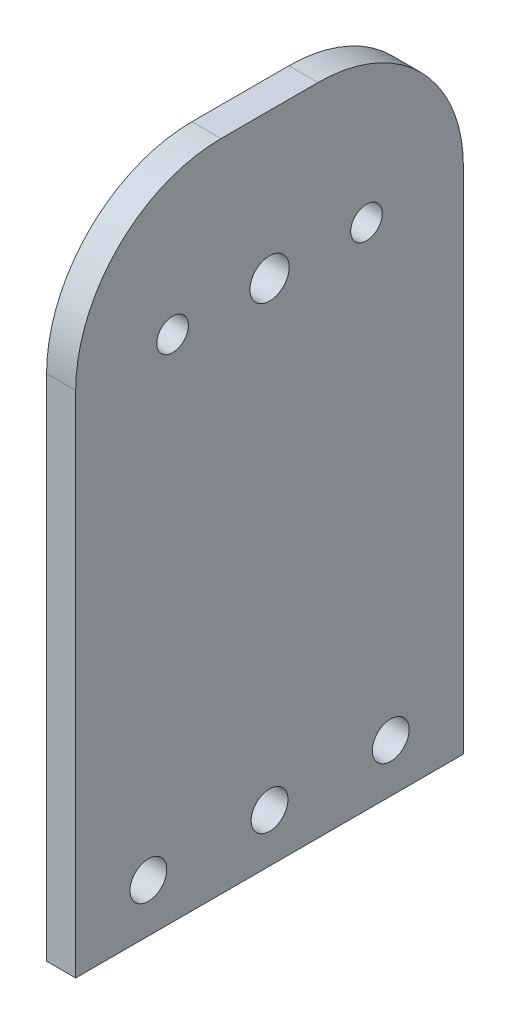
ISO-10303-21;
HEADER;
FILE_DESCRIPTION(('STEP AP214'),'2;1');
FILE_NAME('part.step','',(''),(''),'','','');
FILE_SCHEMA(('AUTOMOTIVE_DESIGN { 1 0 10303 214 1 1 1 1 }'));
ENDSEC;
DATA;
#1=APPLICATION_CONTEXT('core data for automotive mechanical design processes');
#2=APPLICATION_PROTOCOL_DEFINITION('international standard','automotive_design',2000,#1);
#3=PRODUCT_CONTEXT('',#1,'mechanical');
#4=PRODUCT('Part','Part','',(#3));
#5=PRODUCT_RELATED_PRODUCT_CATEGORY('part','',(#4));
#6=PRODUCT_DEFINITION_FORMATION('','',#4);
#7=PRODUCT_DEFINITION_CONTEXT('part definition',#1,'design');
#8=PRODUCT_DEFINITION('design','',#6,#7);
#9=PRODUCT_DEFINITION_SHAPE('','',#8);
#10=(LENGTH_UNIT() NAMED_UNIT(*) SI_UNIT(.MILLI.,.METRE.));
#11=(NAMED_UNIT(*) PLANE_ANGLE_UNIT() SI_UNIT($,.RADIAN.));
#12=(NAMED_UNIT(*) SI_UNIT($,.STERADIAN.) SOLID_ANGLE_UNIT());
#13=UNCERTAINTY_MEASURE_WITH_UNIT(LENGTH_MEASURE(1.E-05),#10,'distance_accuracy_value','');
#14=(GEOMETRIC_REPRESENTATION_CONTEXT(3) GLOBAL_UNCERTAINTY_ASSIGNED_CONTEXT((#13)) GLOBAL_UNIT_ASSIGNED_CONTEXT((#10,
#11,#12)) REPRESENTATION_CONTEXT('',''));
#15=CARTESIAN_POINT('',(0.,0.,0.));
#16=DIRECTION('',(0.,0.,1.));
#17=DIRECTION('',(1.,0.,0.));
#18=AXIS2_PLACEMENT_3D('',#15,#16,#17);
#19=CARTESIAN_POINT('',(3.,52.5,-15.));
#20=DIRECTION('',(-1.,0.,0.));
#21=DIRECTION('',(0.,0.,1.));
#22=AXIS2_PLACEMENT_3D('',#19,#20,#21);
#23=CYLINDRICAL_SURFACE('',#22,15.);
#24=CARTESIAN_POINT('',(0.,52.5,-15.));
#25=DIRECTION('',(1.,0.,0.));
#26=DIRECTION('',(0.,0.,-1.));
#27=AXIS2_PLACEMENT_3D('',#24,#25,#26);
#28=CIRCLE('',#27,15.);
#29=CARTESIAN_POINT('',(0.,52.5,0.));
#30=VERTEX_POINT('',#29);
#31=CARTESIAN_POINT('',(0.,67.5,-15.));
#32=VERTEX_POINT('',#31);
#33=EDGE_CURVE('E129',#30,#32,#28,.F.);
#34=ORIENTED_EDGE('',*,*,#33,.F.);
#35=DIRECTION('',(-1.,0.,0.));
#36=VECTOR('',#35,1.);
#37=CARTESIAN_POINT('',(3.,52.5,0.));
#38=LINE('',#37,#36);
#39=CARTESIAN_POINT('',(3.,52.5,0.));
#40=VERTEX_POINT('',#39);
#41=EDGE_CURVE('E11',#40,#30,#38,.T.);
#42=ORIENTED_EDGE('',*,*,#41,.F.);
#43=CARTESIAN_POINT('',(3.,52.5,-15.));
#44=DIRECTION('',(1.,0.,0.));
#45=DIRECTION('',(0.,0.,-1.));
#46=AXIS2_PLACEMENT_3D('',#43,#44,#45);
#47=CIRCLE('',#46,15.);
#48=CARTESIAN_POINT('',(3.,67.5,-15.));
#49=VERTEX_POINT('',#48);
#50=EDGE_CURVE('E149',#40,#49,#47,.F.);
#51=ORIENTED_EDGE('',*,*,#50,.T.);
#52=DIRECTION('',(-1.,0.,0.));
#53=VECTOR('',#52,1.);
#54=CARTESIAN_POINT('',(3.,67.5,-15.));
#55=LINE('',#54,#53);
#56=EDGE_CURVE('E59',#49,#32,#55,.T.);
#57=ORIENTED_EDGE('',*,*,#56,.T.);
#58=EDGE_LOOP('',(#34,#42,#51,#57));
#59=FACE_BOUND('',#58,.T.);
#60=ADVANCED_FACE('F41',(#59),#23,.T.);
#61=CARTESIAN_POINT('',(3.,0.,0.));
#62=DIRECTION('',(0.,0.,1.));
#63=DIRECTION('',(1.,0.,0.));
#64=AXIS2_PLACEMENT_3D('',#61,#62,#63);
#65=PLANE('',#64);
#66=DIRECTION('',(0.,1.,0.));
#67=VECTOR('',#66,1.);
#68=CARTESIAN_POINT('',(0.,0.,0.));
#69=LINE('',#68,#67);
#70=CARTESIAN_POINT('',(0.,0.,0.));
#71=VERTEX_POINT('',#70);
#72=EDGE_CURVE('E132',#71,#30,#69,.T.);
#73=ORIENTED_EDGE('',*,*,#72,.F.);
#74=DIRECTION('',(-1.,0.,0.));
#75=VECTOR('',#74,1.);
#76=CARTESIAN_POINT('',(3.,0.,0.));
#77=LINE('',#76,#75);
#78=CARTESIAN_POINT('',(3.,0.,0.));
#79=VERTEX_POINT('',#78);
#80=EDGE_CURVE('E51',#79,#71,#77,.T.);
#81=ORIENTED_EDGE('',*,*,#80,.F.);
#82=DIRECTION('',(0.,1.,0.));
#83=VECTOR('',#82,1.);
#84=CARTESIAN_POINT('',(3.,0.,0.));
#85=LINE('',#84,#83);
#86=EDGE_CURVE('E166',#79,#40,#85,.T.);
#87=ORIENTED_EDGE('',*,*,#86,.T.);
#88=ORIENTED_EDGE('',*,*,#41,.T.);
#89=EDGE_LOOP('',(#73,#81,#87,#88));
#90=FACE_BOUND('',#89,.T.);
#91=ADVANCED_FACE('F165',(#90),#65,.T.);
#92=CARTESIAN_POINT('',(3.,0.,0.));
#93=DIRECTION('',(0.,1.,0.));
#94=DIRECTION('',(0.,0.,1.));
#95=AXIS2_PLACEMENT_3D('',#92,#93,#94);
#96=PLANE('',#95);
#97=DIRECTION('',(0.,0.,-1.));
#98=VECTOR('',#97,1.);
#99=CARTESIAN_POINT('',(0.,0.,0.));
#100=LINE('',#99,#98);
#101=CARTESIAN_POINT('',(0.,0.,-40.));
#102=VERTEX_POINT('',#101);
#103=EDGE_CURVE('E137',#71,#102,#100,.T.);
#104=ORIENTED_EDGE('',*,*,#103,.T.);
#105=DIRECTION('',(-1.,0.,0.));
#106=VECTOR('',#105,1.);
#107=CARTESIAN_POINT('',(3.,0.,-40.));
#108=LINE('',#107,#106);
#109=CARTESIAN_POINT('',(3.,0.,-40.));
#110=VERTEX_POINT('',#109);
#111=EDGE_CURVE('E119',#110,#102,#108,.T.);
#112=ORIENTED_EDGE('',*,*,#111,.F.);
#113=DIRECTION('',(0.,0.,-1.));
#114=VECTOR('',#113,1.);
#115=CARTESIAN_POINT('',(3.,0.,0.));
#116=LINE('',#115,#114);
#117=EDGE_CURVE('E105',#79,#110,#116,.T.);
#118=ORIENTED_EDGE('',*,*,#117,.F.);
#119=ORIENTED_EDGE('',*,*,#80,.T.);
#120=EDGE_LOOP('',(#104,#112,#118,#119));
#121=FACE_BOUND('',#120,.T.);
#122=ADVANCED_FACE('F159',(#121),#96,.F.);
#123=CARTESIAN_POINT('',(3.,0.,-40.));
#124=DIRECTION('',(0.,0.,1.));
#125=DIRECTION('',(1.,0.,0.));
#126=AXIS2_PLACEMENT_3D('',#123,#124,#125);
#127=PLANE('',#126);
#128=DIRECTION('',(0.,1.,0.));
#129=VECTOR('',#128,1.);
#130=CARTESIAN_POINT('',(0.,0.,-40.));
#131=LINE('',#130,#129);
#132=CARTESIAN_POINT('',(0.,52.5,-40.));
#133=VERTEX_POINT('',#132);
#134=EDGE_CURVE('E115',#102,#133,#131,.T.);
#135=ORIENTED_EDGE('',*,*,#134,.T.);
#136=DIRECTION('',(-1.,0.,0.));
#137=VECTOR('',#136,1.);
#138=CARTESIAN_POINT('',(3.,52.5,-40.));
#139=LINE('',#138,#137);
#140=CARTESIAN_POINT('',(3.,52.5,-40.));
#141=VERTEX_POINT('',#140);
#142=EDGE_CURVE('E112',#141,#133,#139,.T.);
#143=ORIENTED_EDGE('',*,*,#142,.F.);
#144=DIRECTION('',(0.,1.,0.));
#145=VECTOR('',#144,1.);
#146=CARTESIAN_POINT('',(3.,0.,-40.));
#147=LINE('',#146,#145);
#148=EDGE_CURVE('E97',#110,#141,#147,.T.);
#149=ORIENTED_EDGE('',*,*,#148,.F.);
#150=ORIENTED_EDGE('',*,*,#111,.T.);
#151=EDGE_LOOP('',(#135,#143,#149,#150));
#152=FACE_BOUND('',#151,.T.);
#153=ADVANCED_FACE('F113',(#152),#127,.F.);
#154=CARTESIAN_POINT('',(3.,52.5,-25.));
#155=DIRECTION('',(-1.,0.,0.));
#156=DIRECTION('',(0.,0.,1.));
#157=AXIS2_PLACEMENT_3D('',#154,#155,#156);
#158=CYLINDRICAL_SURFACE('',#157,15.);
#159=CARTESIAN_POINT('',(0.,52.5,-25.));
#160=DIRECTION('',(1.,0.,0.));
#161=DIRECTION('',(0.,0.,-1.));
#162=AXIS2_PLACEMENT_3D('',#159,#160,#161);
#163=CIRCLE('',#162,15.);
#164=CARTESIAN_POINT('',(0.,67.5,-25.));
#165=VERTEX_POINT('',#164);
#166=EDGE_CURVE('E142',#165,#133,#163,.F.);
#167=ORIENTED_EDGE('',*,*,#166,.F.);
#168=DIRECTION('',(-1.,0.,0.));
#169=VECTOR('',#168,1.);
#170=CARTESIAN_POINT('',(3.,67.5,-25.));
#171=LINE('',#170,#169);
#172=CARTESIAN_POINT('',(3.,67.5,-25.));
#173=VERTEX_POINT('',#172);
#174=EDGE_CURVE('E78',#173,#165,#171,.T.);
#175=ORIENTED_EDGE('',*,*,#174,.F.);
#176=CARTESIAN_POINT('',(3.,52.5,-25.));
#177=DIRECTION('',(1.,0.,0.));
#178=DIRECTION('',(0.,0.,-1.));
#179=AXIS2_PLACEMENT_3D('',#176,#177,#178);
#180=CIRCLE('',#179,15.);
#181=EDGE_CURVE('E102',#173,#141,#180,.F.);
#182=ORIENTED_EDGE('',*,*,#181,.T.);
#183=ORIENTED_EDGE('',*,*,#142,.T.);
#184=EDGE_LOOP('',(#167,#175,#182,#183));
#185=FACE_BOUND('',#184,.T.);
#186=ADVANCED_FACE('F121',(#185),#158,.T.);
#187=CARTESIAN_POINT('',(3.,67.5,0.));
#188=DIRECTION('',(0.,1.,0.));
#189=DIRECTION('',(0.,0.,1.));
#190=AXIS2_PLACEMENT_3D('',#187,#188,#189);
#191=PLANE('',#190);
#192=DIRECTION('',(0.,0.,-1.));
#193=VECTOR('',#192,1.);
#194=CARTESIAN_POINT('',(0.,67.5,0.));
#195=LINE('',#194,#193);
#196=EDGE_CURVE('E145',#32,#165,#195,.T.);
#197=ORIENTED_EDGE('',*,*,#196,.F.);
#198=ORIENTED_EDGE('',*,*,#56,.F.);
#199=DIRECTION('',(0.,0.,-1.));
#200=VECTOR('',#199,1.);
#201=CARTESIAN_POINT('',(3.,67.5,0.));
#202=LINE('',#201,#200);
#203=EDGE_CURVE('E123',#49,#173,#202,.T.);
#204=ORIENTED_EDGE('',*,*,#203,.T.);
#205=ORIENTED_EDGE('',*,*,#174,.T.);
#206=EDGE_LOOP('',(#197,#198,#204,#205));
#207=FACE_BOUND('',#206,.T.);
#208=ADVANCED_FACE('F167',(#207),#191,.T.);
#209=CARTESIAN_POINT('',(3.,0.,0.));
#210=DIRECTION('',(1.,0.,0.));
#211=DIRECTION('',(0.,0.,-1.));
#212=AXIS2_PLACEMENT_3D('',#209,#210,#211);
#213=PLANE('',#212);
#214=CARTESIAN_POINT('',(3.,52.5,-10.));
#215=DIRECTION('',(1.,0.,0.));
#216=DIRECTION('',(0.,0.,-1.));
#217=AXIS2_PLACEMENT_3D('',#214,#215,#216);
#218=CIRCLE('',#217,1.63194999999999);
#219=CARTESIAN_POINT('',(3.,52.5,-11.63195));
#220=VERTEX_POINT('',#219);
#221=EDGE_CURVE('E284',#220,#220,#218,.T.);
#222=ORIENTED_EDGE('',*,*,#221,.F.);
#223=EDGE_LOOP('',(#222));
#224=FACE_BOUND('',#223,.T.);
#225=CARTESIAN_POINT('',(3.,52.5,-30.));
#226=DIRECTION('',(1.,0.,0.));
#227=DIRECTION('',(0.,0.,-1.));
#228=AXIS2_PLACEMENT_3D('',#225,#226,#227);
#229=CIRCLE('',#228,1.63194999999999);
#230=CARTESIAN_POINT('',(3.,52.5,-31.63195));
#231=VERTEX_POINT('',#230);
#232=EDGE_CURVE('E288',#231,#231,#229,.T.);
#233=ORIENTED_EDGE('',*,*,#232,.F.);
#234=EDGE_LOOP('',(#233));
#235=FACE_BOUND('',#234,.T.);
#236=CARTESIAN_POINT('',(3.,52.5,-20.));
#237=DIRECTION('',(1.,0.,0.));
#238=DIRECTION('',(0.,0.,-1.));
#239=AXIS2_PLACEMENT_3D('',#236,#237,#238);
#240=CIRCLE('',#239,2.025);
#241=CARTESIAN_POINT('',(3.,52.5,-22.025));
#242=VERTEX_POINT('',#241);
#243=EDGE_CURVE('E298',#242,#242,#240,.T.);
#244=ORIENTED_EDGE('',*,*,#243,.F.);
#245=EDGE_LOOP('',(#244));
#246=FACE_BOUND('',#245,.T.);
#247=CARTESIAN_POINT('',(3.,5.,-7.5));
#248=DIRECTION('',(1.,0.,0.));
#249=DIRECTION('',(0.,0.,-1.));
#250=AXIS2_PLACEMENT_3D('',#247,#248,#249);
#251=CIRCLE('',#250,1.89864999999999);
#252=CARTESIAN_POINT('',(3.,5.,-9.39864999999999));
#253=VERTEX_POINT('',#252);
#254=EDGE_CURVE('E302',#253,#253,#251,.T.);
#255=ORIENTED_EDGE('',*,*,#254,.F.);
#256=EDGE_LOOP('',(#255));
#257=FACE_BOUND('',#256,.T.);
#258=CARTESIAN_POINT('',(3.,5.,-20.));
#259=DIRECTION('',(1.,0.,0.));
#260=DIRECTION('',(0.,0.,-1.));
#261=AXIS2_PLACEMENT_3D('',#258,#259,#260);
#262=CIRCLE('',#261,1.89864999999999);
#263=CARTESIAN_POINT('',(3.,5.,-21.89865));
#264=VERTEX_POINT('',#263);
#265=EDGE_CURVE('E310',#264,#264,#262,.T.);
#266=ORIENTED_EDGE('',*,*,#265,.F.);
#267=EDGE_LOOP('',(#266));
#268=FACE_BOUND('',#267,.T.);
#269=CARTESIAN_POINT('',(3.,5.,-32.5));
#270=DIRECTION('',(1.,0.,0.));
#271=DIRECTION('',(0.,0.,-1.));
#272=AXIS2_PLACEMENT_3D('',#269,#270,#271);
#273=CIRCLE('',#272,1.89864999999999);
#274=CARTESIAN_POINT('',(3.,5.,-34.39865));
#275=VERTEX_POINT('',#274);
#276=EDGE_CURVE('E318',#275,#275,#273,.T.);
#277=ORIENTED_EDGE('',*,*,#276,.F.);
#278=EDGE_LOOP('',(#277));
#279=FACE_BOUND('',#278,.T.);
#280=ORIENTED_EDGE('',*,*,#50,.F.);
#281=ORIENTED_EDGE('',*,*,#86,.F.);
#282=ORIENTED_EDGE('',*,*,#117,.T.);
#283=ORIENTED_EDGE('',*,*,#148,.T.);
#284=ORIENTED_EDGE('',*,*,#181,.F.);
#285=ORIENTED_EDGE('',*,*,#203,.F.);
#286=EDGE_LOOP('',(#280,#281,#282,#283,#284,#285));
#287=FACE_BOUND('',#286,.T.);
#288=ADVANCED_FACE('F99',(#224,#235,#246,#257,#268,#279,#287),#213,.T.);
#289=CARTESIAN_POINT('',(0.,0.,0.));
#290=DIRECTION('',(1.,0.,0.));
#291=DIRECTION('',(0.,0.,-1.));
#292=AXIS2_PLACEMENT_3D('',#289,#290,#291);
#293=PLANE('',#292);
#294=CARTESIAN_POINT('',(0.,52.5,-10.));
#295=DIRECTION('',(1.,0.,0.));
#296=DIRECTION('',(0.,0.,-1.));
#297=AXIS2_PLACEMENT_3D('',#294,#295,#296);
#298=CIRCLE('',#297,1.63195);
#299=CARTESIAN_POINT('',(0.,52.5,-11.63195));
#300=VERTEX_POINT('',#299);
#301=EDGE_CURVE('E281',#300,#300,#298,.T.);
#302=ORIENTED_EDGE('',*,*,#301,.T.);
#303=EDGE_LOOP('',(#302));
#304=FACE_BOUND('',#303,.T.);
#305=CARTESIAN_POINT('',(0.,52.5,-30.));
#306=DIRECTION('',(1.,0.,0.));
#307=DIRECTION('',(0.,0.,-1.));
#308=AXIS2_PLACEMENT_3D('',#305,#306,#307);
#309=CIRCLE('',#308,1.63195);
#310=CARTESIAN_POINT('',(0.,52.5,-31.63195));
#311=VERTEX_POINT('',#310);
#312=EDGE_CURVE('E294',#311,#311,#309,.T.);
#313=ORIENTED_EDGE('',*,*,#312,.T.);
#314=EDGE_LOOP('',(#313));
#315=FACE_BOUND('',#314,.T.);
#316=CARTESIAN_POINT('',(0.,52.5,-20.));
#317=DIRECTION('',(1.,0.,0.));
#318=DIRECTION('',(0.,0.,-1.));
#319=AXIS2_PLACEMENT_3D('',#316,#317,#318);
#320=CIRCLE('',#319,2.025);
#321=CARTESIAN_POINT('',(0.,52.5,-22.025));
#322=VERTEX_POINT('',#321);
#323=EDGE_CURVE('E44',#322,#322,#320,.T.);
#324=ORIENTED_EDGE('',*,*,#323,.T.);
#325=EDGE_LOOP('',(#324));
#326=FACE_BOUND('',#325,.T.);
#327=CARTESIAN_POINT('',(0.,5.,-7.5));
#328=DIRECTION('',(1.,0.,0.));
#329=DIRECTION('',(0.,0.,-1.));
#330=AXIS2_PLACEMENT_3D('',#327,#328,#329);
#331=CIRCLE('',#330,1.89865);
#332=CARTESIAN_POINT('',(0.,5.,-9.39865));
#333=VERTEX_POINT('',#332);
#334=EDGE_CURVE('E306',#333,#333,#331,.T.);
#335=ORIENTED_EDGE('',*,*,#334,.T.);
#336=EDGE_LOOP('',(#335));
#337=FACE_BOUND('',#336,.T.);
#338=CARTESIAN_POINT('',(0.,5.,-20.));
#339=DIRECTION('',(1.,0.,0.));
#340=DIRECTION('',(0.,0.,-1.));
#341=AXIS2_PLACEMENT_3D('',#338,#339,#340);
#342=CIRCLE('',#341,1.89865);
#343=CARTESIAN_POINT('',(0.,5.,-21.89865));
#344=VERTEX_POINT('',#343);
#345=EDGE_CURVE('E314',#344,#344,#342,.T.);
#346=ORIENTED_EDGE('',*,*,#345,.T.);
#347=EDGE_LOOP('',(#346));
#348=FACE_BOUND('',#347,.T.);
#349=CARTESIAN_POINT('',(0.,5.,-32.5));
#350=DIRECTION('',(1.,0.,0.));
#351=DIRECTION('',(0.,0.,-1.));
#352=AXIS2_PLACEMENT_3D('',#349,#350,#351);
#353=CIRCLE('',#352,1.89865);
#354=CARTESIAN_POINT('',(0.,5.,-34.39865));
#355=VERTEX_POINT('',#354);
#356=EDGE_CURVE('E133',#355,#355,#353,.T.);
#357=ORIENTED_EDGE('',*,*,#356,.T.);
#358=EDGE_LOOP('',(#357));
#359=FACE_BOUND('',#358,.T.);
#360=ORIENTED_EDGE('',*,*,#33,.T.);
#361=ORIENTED_EDGE('',*,*,#196,.T.);
#362=ORIENTED_EDGE('',*,*,#166,.T.);
#363=ORIENTED_EDGE('',*,*,#134,.F.);
#364=ORIENTED_EDGE('',*,*,#103,.F.);
#365=ORIENTED_EDGE('',*,*,#72,.T.);
#366=EDGE_LOOP('',(#360,#361,#362,#363,#364,#365));
#367=FACE_BOUND('',#366,.T.);
#368=ADVANCED_FACE('F164',(#304,#315,#326,#337,#348,#359,#367),#293,.F.);
#369=CARTESIAN_POINT('',(3.,5.,-32.5));
#370=DIRECTION('',(1.,0.,0.));
#371=DIRECTION('',(0.,0.,-1.));
#372=AXIS2_PLACEMENT_3D('',#369,#370,#371);
#373=CYLINDRICAL_SURFACE('',#372,1.89864999999999);
#374=ORIENTED_EDGE('',*,*,#356,.F.);
#375=EDGE_LOOP('',(#374));
#376=FACE_BOUND('',#375,.T.);
#377=ORIENTED_EDGE('',*,*,#276,.T.);
#378=EDGE_LOOP('',(#377));
#379=FACE_BOUND('',#378,.T.);
#380=ADVANCED_FACE('F206',(#376,#379),#373,.F.);
#381=CARTESIAN_POINT('',(3.,5.,-20.));
#382=DIRECTION('',(1.,0.,0.));
#383=DIRECTION('',(0.,0.,-1.));
#384=AXIS2_PLACEMENT_3D('',#381,#382,#383);
#385=CYLINDRICAL_SURFACE('',#384,1.89864999999999);
#386=ORIENTED_EDGE('',*,*,#345,.F.);
#387=EDGE_LOOP('',(#386));
#388=FACE_BOUND('',#387,.T.);
#389=ORIENTED_EDGE('',*,*,#265,.T.);
#390=EDGE_LOOP('',(#389));
#391=FACE_BOUND('',#390,.T.);
#392=ADVANCED_FACE('F211',(#388,#391),#385,.F.);
#393=CARTESIAN_POINT('',(3.,5.,-7.5));
#394=DIRECTION('',(1.,0.,0.));
#395=DIRECTION('',(0.,0.,-1.));
#396=AXIS2_PLACEMENT_3D('',#393,#394,#395);
#397=CYLINDRICAL_SURFACE('',#396,1.89864999999999);
#398=ORIENTED_EDGE('',*,*,#334,.F.);
#399=EDGE_LOOP('',(#398));
#400=FACE_BOUND('',#399,.T.);
#401=ORIENTED_EDGE('',*,*,#254,.T.);
#402=EDGE_LOOP('',(#401));
#403=FACE_BOUND('',#402,.T.);
#404=ADVANCED_FACE('F223',(#400,#403),#397,.F.);
#405=CARTESIAN_POINT('',(-7.,52.5,-20.));
#406=DIRECTION('',(1.,0.,0.));
#407=DIRECTION('',(0.,0.,-1.));
#408=AXIS2_PLACEMENT_3D('',#405,#406,#407);
#409=CYLINDRICAL_SURFACE('',#408,2.025);
#410=ORIENTED_EDGE('',*,*,#243,.T.);
#411=EDGE_LOOP('',(#410));
#412=FACE_BOUND('',#411,.T.);
#413=ORIENTED_EDGE('',*,*,#323,.F.);
#414=EDGE_LOOP('',(#413));
#415=FACE_BOUND('',#414,.T.);
#416=ADVANCED_FACE('F233',(#412,#415),#409,.F.);
#417=CARTESIAN_POINT('',(3.,52.5,-30.));
#418=DIRECTION('',(1.,0.,0.));
#419=DIRECTION('',(0.,0.,-1.));
#420=AXIS2_PLACEMENT_3D('',#417,#418,#419);
#421=CYLINDRICAL_SURFACE('',#420,1.63194999999999);
#422=ORIENTED_EDGE('',*,*,#312,.F.);
#423=EDGE_LOOP('',(#422));
#424=FACE_BOUND('',#423,.T.);
#425=ORIENTED_EDGE('',*,*,#232,.T.);
#426=EDGE_LOOP('',(#425));
#427=FACE_BOUND('',#426,.T.);
#428=ADVANCED_FACE('F243',(#424,#427),#421,.F.);
#429=CARTESIAN_POINT('',(3.,52.5,-10.));
#430=DIRECTION('',(1.,0.,0.));
#431=DIRECTION('',(0.,0.,-1.));
#432=AXIS2_PLACEMENT_3D('',#429,#430,#431);
#433=CYLINDRICAL_SURFACE('',#432,1.63194999999999);
#434=ORIENTED_EDGE('',*,*,#301,.F.);
#435=EDGE_LOOP('',(#434));
#436=FACE_BOUND('',#435,.T.);
#437=ORIENTED_EDGE('',*,*,#221,.T.);
#438=EDGE_LOOP('',(#437));
#439=FACE_BOUND('',#438,.T.);
#440=ADVANCED_FACE('F264',(#436,#439),#433,.F.);
#441=CLOSED_SHELL('',(#60,#91,#122,#153,#186,#208,#288,#368,#380,#392,#404,#416,#428,#440));
#442=MANIFOLD_SOLID_BREP('B2',#441);
#443=ADVANCED_BREP_SHAPE_REPRESENTATION('',(#18,#442),#14);
#444=SHAPE_DEFINITION_REPRESENTATION(#9,#443);
ENDSEC;
END-ISO-10303-21;
